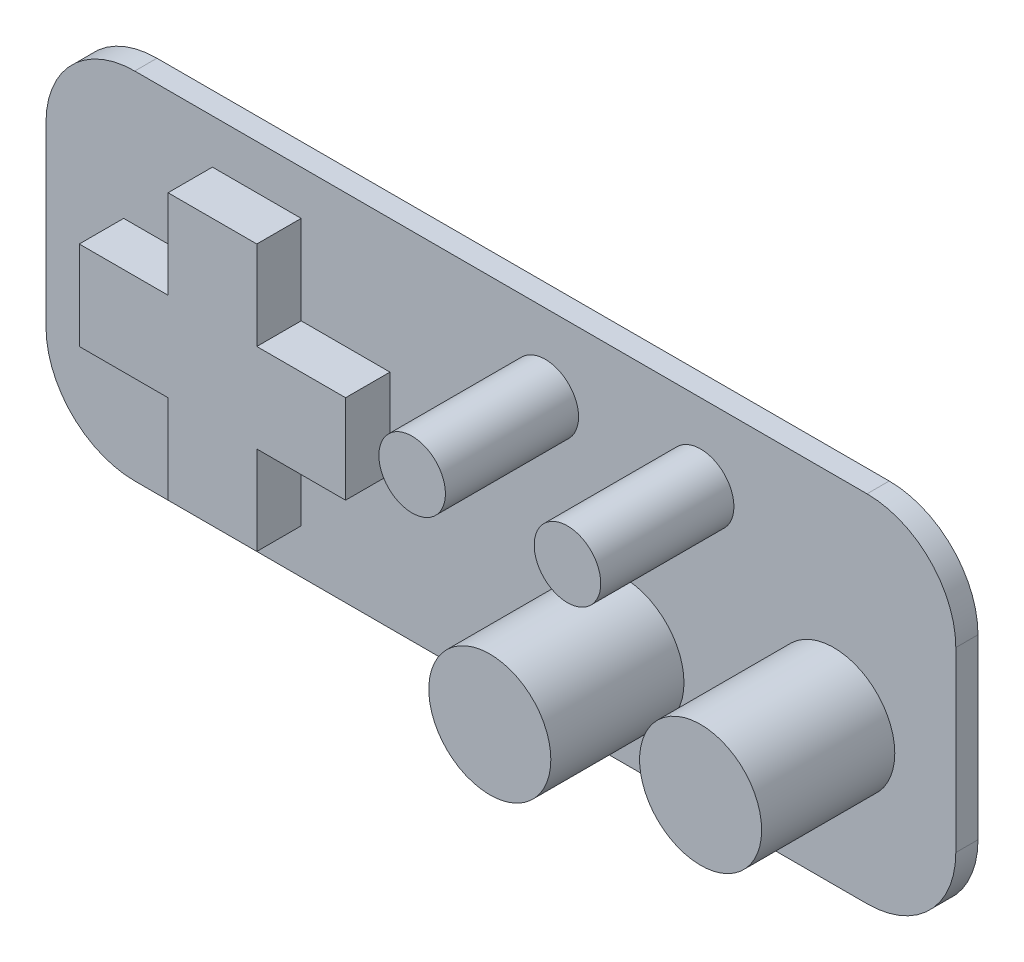
ISO-10303-21;
HEADER;
FILE_DESCRIPTION(('STEP AP214'),'2;1');
FILE_NAME('part.step','',(''),(''),'','','');
FILE_SCHEMA(('AUTOMOTIVE_DESIGN { 1 0 10303 214 1 1 1 1 }'));
ENDSEC;
DATA;
#1=APPLICATION_CONTEXT('core data for automotive mechanical design processes');
#2=APPLICATION_PROTOCOL_DEFINITION('international standard','automotive_design',2000,#1);
#3=PRODUCT_CONTEXT('',#1,'mechanical');
#4=PRODUCT('Part','Part','',(#3));
#5=PRODUCT_RELATED_PRODUCT_CATEGORY('part','',(#4));
#6=PRODUCT_DEFINITION_FORMATION('','',#4);
#7=PRODUCT_DEFINITION_CONTEXT('part definition',#1,'design');
#8=PRODUCT_DEFINITION('design','',#6,#7);
#9=PRODUCT_DEFINITION_SHAPE('','',#8);
#10=(LENGTH_UNIT() NAMED_UNIT(*) SI_UNIT(.MILLI.,.METRE.));
#11=(NAMED_UNIT(*) PLANE_ANGLE_UNIT() SI_UNIT($,.RADIAN.));
#12=(NAMED_UNIT(*) SI_UNIT($,.STERADIAN.) SOLID_ANGLE_UNIT());
#13=UNCERTAINTY_MEASURE_WITH_UNIT(LENGTH_MEASURE(1.E-05),#10,'distance_accuracy_value','');
#14=(GEOMETRIC_REPRESENTATION_CONTEXT(3) GLOBAL_UNCERTAINTY_ASSIGNED_CONTEXT((#13)) GLOBAL_UNIT_ASSIGNED_CONTEXT((#10,
#11,#12)) REPRESENTATION_CONTEXT('',''));
#15=CARTESIAN_POINT('',(0.,0.,0.));
#16=DIRECTION('',(0.,0.,1.));
#17=DIRECTION('',(1.,0.,0.));
#18=AXIS2_PLACEMENT_3D('',#15,#16,#17);
#19=CARTESIAN_POINT('',(-15.7826086956522,4.75,1.));
#20=DIRECTION('',(0.,0.,1.));
#21=DIRECTION('',(1.,0.,0.));
#22=AXIS2_PLACEMENT_3D('',#19,#20,#21);
#23=PLANE('',#22);
#24=CARTESIAN_POINT('',(15.7173913043478,-0.750000000000002,1.));
#25=DIRECTION('',(0.,0.,1.));
#26=DIRECTION('',(1.,0.,0.));
#27=AXIS2_PLACEMENT_3D('',#24,#25,#26);
#28=CIRCLE('',#27,2.74999999999999);
#29=CARTESIAN_POINT('',(18.4673913043478,-0.750000000000002,1.));
#30=VERTEX_POINT('',#29);
#31=EDGE_CURVE('E212',#30,#30,#28,.T.);
#32=ORIENTED_EDGE('',*,*,#31,.F.);
#33=EDGE_LOOP('',(#32));
#34=FACE_BOUND('',#33,.T.);
#35=CARTESIAN_POINT('',(6.21739130434783,-2.75,1.));
#36=DIRECTION('',(0.,0.,1.));
#37=DIRECTION('',(1.,0.,0.));
#38=AXIS2_PLACEMENT_3D('',#35,#36,#37);
#39=CIRCLE('',#38,2.75);
#40=CARTESIAN_POINT('',(8.96739130434783,-2.75,1.));
#41=VERTEX_POINT('',#40);
#42=EDGE_CURVE('E206',#41,#41,#39,.T.);
#43=ORIENTED_EDGE('',*,*,#42,.F.);
#44=EDGE_LOOP('',(#43));
#45=FACE_BOUND('',#44,.T.);
#46=CARTESIAN_POINT('',(9.71739130434783,5.25,1.));
#47=DIRECTION('',(0.,0.,1.));
#48=DIRECTION('',(1.,0.,0.));
#49=AXIS2_PLACEMENT_3D('',#46,#47,#48);
#50=CIRCLE('',#49,1.5);
#51=CARTESIAN_POINT('',(11.2173913043478,5.25,1.));
#52=VERTEX_POINT('',#51);
#53=EDGE_CURVE('E200',#52,#52,#50,.T.);
#54=ORIENTED_EDGE('',*,*,#53,.F.);
#55=EDGE_LOOP('',(#54));
#56=FACE_BOUND('',#55,.T.);
#57=CARTESIAN_POINT('',(2.71739130434783,5.25,1.));
#58=DIRECTION('',(0.,0.,1.));
#59=DIRECTION('',(1.,0.,0.));
#60=AXIS2_PLACEMENT_3D('',#57,#58,#59);
#61=CIRCLE('',#60,1.5);
#62=CARTESIAN_POINT('',(4.21739130434783,5.25,1.));
#63=VERTEX_POINT('',#62);
#64=EDGE_CURVE('E194',#63,#63,#61,.T.);
#65=ORIENTED_EDGE('',*,*,#64,.F.);
#66=EDGE_LOOP('',(#65));
#67=FACE_BOUND('',#66,.T.);
#68=CARTESIAN_POINT('',(-15.7826086956522,4.75,1.));
#69=DIRECTION('',(0.,0.,1.));
#70=DIRECTION('',(1.,0.,0.));
#71=AXIS2_PLACEMENT_3D('',#68,#69,#70);
#72=CIRCLE('',#71,4.);
#73=CARTESIAN_POINT('',(-15.7826086956521,8.75,1.));
#74=VERTEX_POINT('',#73);
#75=CARTESIAN_POINT('',(-19.7826086956522,4.74999999999997,1.));
#76=VERTEX_POINT('',#75);
#77=EDGE_CURVE('E161',#74,#76,#72,.T.);
#78=ORIENTED_EDGE('',*,*,#77,.T.);
#79=DIRECTION('',(0.,-1.,0.));
#80=VECTOR('',#79,1.);
#81=CARTESIAN_POINT('',(-19.7826086956522,4.74999999999997,1.));
#82=LINE('',#81,#80);
#83=CARTESIAN_POINT('',(-19.7826086956522,-3.24999999999997,1.));
#84=VERTEX_POINT('',#83);
#85=EDGE_CURVE('E102',#76,#84,#82,.T.);
#86=ORIENTED_EDGE('',*,*,#85,.T.);
#87=CARTESIAN_POINT('',(-15.7826086956522,-3.25,1.));
#88=DIRECTION('',(0.,0.,1.));
#89=DIRECTION('',(1.,0.,0.));
#90=AXIS2_PLACEMENT_3D('',#87,#88,#89);
#91=CIRCLE('',#90,4.);
#92=CARTESIAN_POINT('',(-15.7826086956521,-7.25,1.));
#93=VERTEX_POINT('',#92);
#94=EDGE_CURVE('E176',#84,#93,#91,.T.);
#95=ORIENTED_EDGE('',*,*,#94,.T.);
#96=DIRECTION('',(1.,0.,0.));
#97=VECTOR('',#96,1.);
#98=CARTESIAN_POINT('',(-15.7826086956521,-7.25,1.));
#99=LINE('',#98,#97);
#100=CARTESIAN_POINT('',(17.2173913043478,-7.25,1.));
#101=VERTEX_POINT('',#100);
#102=EDGE_CURVE('E188',#93,#101,#99,.T.);
#103=ORIENTED_EDGE('',*,*,#102,.T.);
#104=CARTESIAN_POINT('',(17.2173913043478,-3.25,1.));
#105=DIRECTION('',(0.,0.,1.));
#106=DIRECTION('',(1.,0.,0.));
#107=AXIS2_PLACEMENT_3D('',#104,#105,#106);
#108=CIRCLE('',#107,4.);
#109=CARTESIAN_POINT('',(21.2173913043478,-3.25,1.));
#110=VERTEX_POINT('',#109);
#111=EDGE_CURVE('E124',#101,#110,#108,.T.);
#112=ORIENTED_EDGE('',*,*,#111,.T.);
#113=DIRECTION('',(0.,1.,0.));
#114=VECTOR('',#113,1.);
#115=CARTESIAN_POINT('',(21.2173913043478,4.75,1.));
#116=LINE('',#115,#114);
#117=CARTESIAN_POINT('',(21.2173913043478,4.75,1.));
#118=VERTEX_POINT('',#117);
#119=EDGE_CURVE('E117',#110,#118,#116,.T.);
#120=ORIENTED_EDGE('',*,*,#119,.T.);
#121=CARTESIAN_POINT('',(17.2173913043478,4.75,1.));
#122=DIRECTION('',(0.,0.,1.));
#123=DIRECTION('',(-1.,0.,0.));
#124=AXIS2_PLACEMENT_3D('',#121,#122,#123);
#125=CIRCLE('',#124,4.);
#126=CARTESIAN_POINT('',(17.2173913043478,8.75,1.));
#127=VERTEX_POINT('',#126);
#128=EDGE_CURVE('E121',#118,#127,#125,.T.);
#129=ORIENTED_EDGE('',*,*,#128,.T.);
#130=DIRECTION('',(-1.,0.,0.));
#131=VECTOR('',#130,1.);
#132=CARTESIAN_POINT('',(-15.7826086956521,8.75,1.));
#133=LINE('',#132,#131);
#134=EDGE_CURVE('E61',#127,#74,#133,.T.);
#135=ORIENTED_EDGE('',*,*,#134,.T.);
#136=EDGE_LOOP('',(#78,#86,#95,#103,#112,#120,#129,#135));
#137=FACE_BOUND('',#136,.T.);
#138=DIRECTION('',(1.,0.,0.));
#139=VECTOR('',#138,1.);
#140=CARTESIAN_POINT('',(-15.7826086956522,6.75,1.));
#141=LINE('',#140,#139);
#142=CARTESIAN_POINT('',(-12.2826086956522,6.75,1.));
#143=VERTEX_POINT('',#142);
#144=CARTESIAN_POINT('',(-8.28260869565216,6.75,1.));
#145=VERTEX_POINT('',#144);
#146=EDGE_CURVE('E220',#143,#145,#141,.T.);
#147=ORIENTED_EDGE('',*,*,#146,.T.);
#148=DIRECTION('',(0.,-1.,0.));
#149=VECTOR('',#148,1.);
#150=CARTESIAN_POINT('',(-8.28260869565216,4.75,1.));
#151=LINE('',#150,#149);
#152=CARTESIAN_POINT('',(-8.28260869565216,2.75,1.));
#153=VERTEX_POINT('',#152);
#154=EDGE_CURVE('E215',#145,#153,#151,.T.);
#155=ORIENTED_EDGE('',*,*,#154,.T.);
#156=DIRECTION('',(1.,0.,0.));
#157=VECTOR('',#156,1.);
#158=CARTESIAN_POINT('',(-15.7826086956522,2.75,1.));
#159=LINE('',#158,#157);
#160=CARTESIAN_POINT('',(-4.28260869565216,2.75,1.));
#161=VERTEX_POINT('',#160);
#162=EDGE_CURVE('E250',#153,#161,#159,.T.);
#163=ORIENTED_EDGE('',*,*,#162,.T.);
#164=DIRECTION('',(0.,-1.,0.));
#165=VECTOR('',#164,1.);
#166=CARTESIAN_POINT('',(-4.28260869565216,4.75000000000001,1.));
#167=LINE('',#166,#165);
#168=CARTESIAN_POINT('',(-4.28260869565216,-1.25,1.));
#169=VERTEX_POINT('',#168);
#170=EDGE_CURVE('E247',#161,#169,#167,.T.);
#171=ORIENTED_EDGE('',*,*,#170,.T.);
#172=DIRECTION('',(-1.,0.,0.));
#173=VECTOR('',#172,1.);
#174=CARTESIAN_POINT('',(-15.7826086956522,-1.25,1.));
#175=LINE('',#174,#173);
#176=CARTESIAN_POINT('',(-8.28260869565216,-1.25,1.));
#177=VERTEX_POINT('',#176);
#178=EDGE_CURVE('E244',#169,#177,#175,.T.);
#179=ORIENTED_EDGE('',*,*,#178,.T.);
#180=DIRECTION('',(0.,-1.,0.));
#181=VECTOR('',#180,1.);
#182=CARTESIAN_POINT('',(-8.28260869565217,4.75000000000001,1.));
#183=LINE('',#182,#181);
#184=CARTESIAN_POINT('',(-8.28260869565216,-5.25,1.));
#185=VERTEX_POINT('',#184);
#186=EDGE_CURVE('E241',#177,#185,#183,.T.);
#187=ORIENTED_EDGE('',*,*,#186,.T.);
#188=DIRECTION('',(-1.,0.,0.));
#189=VECTOR('',#188,1.);
#190=CARTESIAN_POINT('',(-15.7826086956522,-5.25,1.));
#191=LINE('',#190,#189);
#192=CARTESIAN_POINT('',(-12.2826086956522,-5.25,1.));
#193=VERTEX_POINT('',#192);
#194=EDGE_CURVE('E238',#185,#193,#191,.T.);
#195=ORIENTED_EDGE('',*,*,#194,.T.);
#196=DIRECTION('',(0.,1.,0.));
#197=VECTOR('',#196,1.);
#198=CARTESIAN_POINT('',(-12.2826086956522,4.75,1.));
#199=LINE('',#198,#197);
#200=CARTESIAN_POINT('',(-12.2826086956522,-1.25,1.));
#201=VERTEX_POINT('',#200);
#202=EDGE_CURVE('E235',#193,#201,#199,.T.);
#203=ORIENTED_EDGE('',*,*,#202,.T.);
#204=DIRECTION('',(-1.,0.,0.));
#205=VECTOR('',#204,1.);
#206=CARTESIAN_POINT('',(-15.7826086956522,-1.25,1.));
#207=LINE('',#206,#205);
#208=CARTESIAN_POINT('',(-16.2826086956522,-1.25,1.));
#209=VERTEX_POINT('',#208);
#210=EDGE_CURVE('E232',#201,#209,#207,.T.);
#211=ORIENTED_EDGE('',*,*,#210,.T.);
#212=DIRECTION('',(0.,1.,0.));
#213=VECTOR('',#212,1.);
#214=CARTESIAN_POINT('',(-16.2826086956522,4.75,1.));
#215=LINE('',#214,#213);
#216=CARTESIAN_POINT('',(-16.2826086956522,2.75,1.));
#217=VERTEX_POINT('',#216);
#218=EDGE_CURVE('E229',#209,#217,#215,.T.);
#219=ORIENTED_EDGE('',*,*,#218,.T.);
#220=DIRECTION('',(1.,0.,0.));
#221=VECTOR('',#220,1.);
#222=CARTESIAN_POINT('',(-15.7826086956522,2.75,1.));
#223=LINE('',#222,#221);
#224=CARTESIAN_POINT('',(-12.2826086956522,2.75,1.));
#225=VERTEX_POINT('',#224);
#226=EDGE_CURVE('E226',#217,#225,#223,.T.);
#227=ORIENTED_EDGE('',*,*,#226,.T.);
#228=DIRECTION('',(0.,1.,0.));
#229=VECTOR('',#228,1.);
#230=CARTESIAN_POINT('',(-12.2826086956522,4.75,1.));
#231=LINE('',#230,#229);
#232=EDGE_CURVE('E223',#225,#143,#231,.T.);
#233=ORIENTED_EDGE('',*,*,#232,.T.);
#234=EDGE_LOOP('',(#147,#155,#163,#171,#179,#187,#195,#203,#211,#219,#227,#233));
#235=FACE_BOUND('',#234,.T.);
#236=ADVANCED_FACE('F37',(#34,#45,#56,#67,#137,#235),#23,.T.);
#237=CARTESIAN_POINT('',(-15.7826086956522,4.75,1.));
#238=DIRECTION('',(0.,0.,-1.));
#239=DIRECTION('',(-1.,0.,0.));
#240=AXIS2_PLACEMENT_3D('',#237,#238,#239);
#241=CYLINDRICAL_SURFACE('',#240,4.);
#242=CARTESIAN_POINT('',(-15.7826086956522,4.75,0.));
#243=DIRECTION('',(0.,0.,1.));
#244=DIRECTION('',(1.,0.,0.));
#245=AXIS2_PLACEMENT_3D('',#242,#243,#244);
#246=CIRCLE('',#245,4.);
#247=CARTESIAN_POINT('',(-15.7826086956521,8.75,0.));
#248=VERTEX_POINT('',#247);
#249=CARTESIAN_POINT('',(-19.7826086956522,4.74999999999997,0.));
#250=VERTEX_POINT('',#249);
#251=EDGE_CURVE('E145',#248,#250,#246,.T.);
#252=ORIENTED_EDGE('',*,*,#251,.T.);
#253=DIRECTION('',(0.,0.,-1.));
#254=VECTOR('',#253,1.);
#255=CARTESIAN_POINT('',(-19.7826086956522,4.74999999999997,1.));
#256=LINE('',#255,#254);
#257=EDGE_CURVE('E11',#76,#250,#256,.T.);
#258=ORIENTED_EDGE('',*,*,#257,.F.);
#259=ORIENTED_EDGE('',*,*,#77,.F.);
#260=DIRECTION('',(0.,0.,-1.));
#261=VECTOR('',#260,1.);
#262=CARTESIAN_POINT('',(-15.7826086956521,8.75,1.));
#263=LINE('',#262,#261);
#264=EDGE_CURVE('E141',#74,#248,#263,.T.);
#265=ORIENTED_EDGE('',*,*,#264,.T.);
#266=EDGE_LOOP('',(#252,#258,#259,#265));
#267=FACE_BOUND('',#266,.T.);
#268=ADVANCED_FACE('F39',(#267),#241,.T.);
#269=CARTESIAN_POINT('',(-19.7826086956522,4.74999999999997,1.));
#270=DIRECTION('',(1.,0.,0.));
#271=DIRECTION('',(0.,1.,0.));
#272=AXIS2_PLACEMENT_3D('',#269,#270,#271);
#273=PLANE('',#272);
#274=DIRECTION('',(0.,-1.,0.));
#275=VECTOR('',#274,1.);
#276=CARTESIAN_POINT('',(-19.7826086956522,4.74999999999997,0.));
#277=LINE('',#276,#275);
#278=CARTESIAN_POINT('',(-19.7826086956522,-3.24999999999997,0.));
#279=VERTEX_POINT('',#278);
#280=EDGE_CURVE('E148',#250,#279,#277,.T.);
#281=ORIENTED_EDGE('',*,*,#280,.T.);
#282=DIRECTION('',(0.,0.,-1.));
#283=VECTOR('',#282,1.);
#284=CARTESIAN_POINT('',(-19.7826086956522,-3.24999999999997,1.));
#285=LINE('',#284,#283);
#286=EDGE_CURVE('E45',#84,#279,#285,.T.);
#287=ORIENTED_EDGE('',*,*,#286,.F.);
#288=ORIENTED_EDGE('',*,*,#85,.F.);
#289=ORIENTED_EDGE('',*,*,#257,.T.);
#290=EDGE_LOOP('',(#281,#287,#288,#289));
#291=FACE_BOUND('',#290,.T.);
#292=ADVANCED_FACE('F436',(#291),#273,.F.);
#293=CARTESIAN_POINT('',(-15.7826086956522,-3.25,1.));
#294=DIRECTION('',(0.,0.,-1.));
#295=DIRECTION('',(-1.,0.,0.));
#296=AXIS2_PLACEMENT_3D('',#293,#294,#295);
#297=CYLINDRICAL_SURFACE('',#296,4.);
#298=CARTESIAN_POINT('',(-15.7826086956522,-3.25,0.));
#299=DIRECTION('',(0.,0.,1.));
#300=DIRECTION('',(1.,0.,0.));
#301=AXIS2_PLACEMENT_3D('',#298,#299,#300);
#302=CIRCLE('',#301,4.);
#303=CARTESIAN_POINT('',(-15.7826086956521,-7.25,0.));
#304=VERTEX_POINT('',#303);
#305=EDGE_CURVE('E151',#279,#304,#302,.T.);
#306=ORIENTED_EDGE('',*,*,#305,.T.);
#307=DIRECTION('',(0.,0.,-1.));
#308=VECTOR('',#307,1.);
#309=CARTESIAN_POINT('',(-15.7826086956521,-7.25,1.));
#310=LINE('',#309,#308);
#311=EDGE_CURVE('E168',#93,#304,#310,.T.);
#312=ORIENTED_EDGE('',*,*,#311,.F.);
#313=ORIENTED_EDGE('',*,*,#94,.F.);
#314=ORIENTED_EDGE('',*,*,#286,.T.);
#315=EDGE_LOOP('',(#306,#312,#313,#314));
#316=FACE_BOUND('',#315,.T.);
#317=ADVANCED_FACE('F174',(#316),#297,.T.);
#318=CARTESIAN_POINT('',(-15.7826086956521,-7.25,1.));
#319=DIRECTION('',(0.,1.,0.));
#320=DIRECTION('',(0.,0.,1.));
#321=AXIS2_PLACEMENT_3D('',#318,#319,#320);
#322=PLANE('',#321);
#323=DIRECTION('',(1.,0.,0.));
#324=VECTOR('',#323,1.);
#325=CARTESIAN_POINT('',(-15.7826086956521,-7.25,0.));
#326=LINE('',#325,#324);
#327=CARTESIAN_POINT('',(17.2173913043478,-7.25,0.));
#328=VERTEX_POINT('',#327);
#329=EDGE_CURVE('E153',#304,#328,#326,.T.);
#330=ORIENTED_EDGE('',*,*,#329,.T.);
#331=DIRECTION('',(0.,0.,-1.));
#332=VECTOR('',#331,1.);
#333=CARTESIAN_POINT('',(17.2173913043478,-7.25,1.));
#334=LINE('',#333,#332);
#335=EDGE_CURVE('E165',#101,#328,#334,.T.);
#336=ORIENTED_EDGE('',*,*,#335,.F.);
#337=ORIENTED_EDGE('',*,*,#102,.F.);
#338=ORIENTED_EDGE('',*,*,#311,.T.);
#339=EDGE_LOOP('',(#330,#336,#337,#338));
#340=FACE_BOUND('',#339,.T.);
#341=ADVANCED_FACE('F184',(#340),#322,.F.);
#342=CARTESIAN_POINT('',(17.2173913043478,-3.25,1.));
#343=DIRECTION('',(0.,0.,-1.));
#344=DIRECTION('',(-1.,0.,0.));
#345=AXIS2_PLACEMENT_3D('',#342,#343,#344);
#346=CYLINDRICAL_SURFACE('',#345,4.);
#347=CARTESIAN_POINT('',(17.2173913043478,-3.25,0.));
#348=DIRECTION('',(0.,0.,1.));
#349=DIRECTION('',(1.,0.,0.));
#350=AXIS2_PLACEMENT_3D('',#347,#348,#349);
#351=CIRCLE('',#350,4.);
#352=CARTESIAN_POINT('',(21.2173913043478,-3.25,0.));
#353=VERTEX_POINT('',#352);
#354=EDGE_CURVE('E155',#328,#353,#351,.T.);
#355=ORIENTED_EDGE('',*,*,#354,.T.);
#356=DIRECTION('',(0.,0.,-1.));
#357=VECTOR('',#356,1.);
#358=CARTESIAN_POINT('',(21.2173913043478,-3.25,1.));
#359=LINE('',#358,#357);
#360=EDGE_CURVE('E136',#110,#353,#359,.T.);
#361=ORIENTED_EDGE('',*,*,#360,.F.);
#362=ORIENTED_EDGE('',*,*,#111,.F.);
#363=ORIENTED_EDGE('',*,*,#335,.T.);
#364=EDGE_LOOP('',(#355,#361,#362,#363));
#365=FACE_BOUND('',#364,.T.);
#366=ADVANCED_FACE('F187',(#365),#346,.T.);
#367=CARTESIAN_POINT('',(21.2173913043478,4.75,1.));
#368=DIRECTION('',(-1.,0.,0.));
#369=DIRECTION('',(0.,0.,1.));
#370=AXIS2_PLACEMENT_3D('',#367,#368,#369);
#371=PLANE('',#370);
#372=DIRECTION('',(0.,1.,0.));
#373=VECTOR('',#372,1.);
#374=CARTESIAN_POINT('',(21.2173913043478,4.75,0.));
#375=LINE('',#374,#373);
#376=CARTESIAN_POINT('',(21.2173913043478,4.75,0.));
#377=VERTEX_POINT('',#376);
#378=EDGE_CURVE('E133',#353,#377,#375,.T.);
#379=ORIENTED_EDGE('',*,*,#378,.T.);
#380=DIRECTION('',(0.,0.,-1.));
#381=VECTOR('',#380,1.);
#382=CARTESIAN_POINT('',(21.2173913043478,4.75,1.));
#383=LINE('',#382,#381);
#384=EDGE_CURVE('E130',#118,#377,#383,.T.);
#385=ORIENTED_EDGE('',*,*,#384,.F.);
#386=ORIENTED_EDGE('',*,*,#119,.F.);
#387=ORIENTED_EDGE('',*,*,#360,.T.);
#388=EDGE_LOOP('',(#379,#385,#386,#387));
#389=FACE_BOUND('',#388,.T.);
#390=ADVANCED_FACE('F131',(#389),#371,.F.);
#391=CARTESIAN_POINT('',(17.2173913043478,4.75,1.));
#392=DIRECTION('',(0.,0.,-1.));
#393=DIRECTION('',(-1.,0.,0.));
#394=AXIS2_PLACEMENT_3D('',#391,#392,#393);
#395=CYLINDRICAL_SURFACE('',#394,4.);
#396=CARTESIAN_POINT('',(17.2173913043478,4.75,0.));
#397=DIRECTION('',(0.,0.,1.));
#398=DIRECTION('',(-1.,0.,0.));
#399=AXIS2_PLACEMENT_3D('',#396,#397,#398);
#400=CIRCLE('',#399,4.);
#401=CARTESIAN_POINT('',(17.2173913043478,8.75,0.));
#402=VERTEX_POINT('',#401);
#403=EDGE_CURVE('E158',#377,#402,#400,.T.);
#404=ORIENTED_EDGE('',*,*,#403,.T.);
#405=DIRECTION('',(0.,0.,-1.));
#406=VECTOR('',#405,1.);
#407=CARTESIAN_POINT('',(17.2173913043478,8.75,1.));
#408=LINE('',#407,#406);
#409=EDGE_CURVE('E137',#127,#402,#408,.T.);
#410=ORIENTED_EDGE('',*,*,#409,.F.);
#411=ORIENTED_EDGE('',*,*,#128,.F.);
#412=ORIENTED_EDGE('',*,*,#384,.T.);
#413=EDGE_LOOP('',(#404,#410,#411,#412));
#414=FACE_BOUND('',#413,.T.);
#415=ADVANCED_FACE('F139',(#414),#395,.T.);
#416=CARTESIAN_POINT('',(-15.7826086956521,8.75,1.));
#417=DIRECTION('',(0.,-1.,0.));
#418=DIRECTION('',(0.,0.,-1.));
#419=AXIS2_PLACEMENT_3D('',#416,#417,#418);
#420=PLANE('',#419);
#421=DIRECTION('',(-1.,0.,0.));
#422=VECTOR('',#421,1.);
#423=CARTESIAN_POINT('',(-15.7826086956521,8.75,0.));
#424=LINE('',#423,#422);
#425=EDGE_CURVE('E94',#402,#248,#424,.T.);
#426=ORIENTED_EDGE('',*,*,#425,.T.);
#427=ORIENTED_EDGE('',*,*,#264,.F.);
#428=ORIENTED_EDGE('',*,*,#134,.F.);
#429=ORIENTED_EDGE('',*,*,#409,.T.);
#430=EDGE_LOOP('',(#426,#427,#428,#429));
#431=FACE_BOUND('',#430,.T.);
#432=ADVANCED_FACE('F446',(#431),#420,.F.);
#433=CARTESIAN_POINT('',(-15.7826086956522,4.75,0.));
#434=DIRECTION('',(0.,0.,1.));
#435=DIRECTION('',(1.,0.,0.));
#436=AXIS2_PLACEMENT_3D('',#433,#434,#435);
#437=PLANE('',#436);
#438=ORIENTED_EDGE('',*,*,#251,.F.);
#439=ORIENTED_EDGE('',*,*,#425,.F.);
#440=ORIENTED_EDGE('',*,*,#403,.F.);
#441=ORIENTED_EDGE('',*,*,#378,.F.);
#442=ORIENTED_EDGE('',*,*,#354,.F.);
#443=ORIENTED_EDGE('',*,*,#329,.F.);
#444=ORIENTED_EDGE('',*,*,#305,.F.);
#445=ORIENTED_EDGE('',*,*,#280,.F.);
#446=EDGE_LOOP('',(#438,#439,#440,#441,#442,#443,#444,#445));
#447=FACE_BOUND('',#446,.T.);
#448=ADVANCED_FACE('F180',(#447),#437,.F.);
#449=CARTESIAN_POINT('',(2.71739130434783,5.25,7.));
#450=DIRECTION('',(0.,0.,-1.));
#451=DIRECTION('',(-1.,0.,0.));
#452=AXIS2_PLACEMENT_3D('',#449,#450,#451);
#453=CYLINDRICAL_SURFACE('',#452,1.5);
#454=CARTESIAN_POINT('',(2.71739130434783,5.25,7.));
#455=DIRECTION('',(0.,0.,1.));
#456=DIRECTION('',(1.,0.,0.));
#457=AXIS2_PLACEMENT_3D('',#454,#455,#456);
#458=CIRCLE('',#457,1.5);
#459=CARTESIAN_POINT('',(4.21739130434783,5.25,7.));
#460=VERTEX_POINT('',#459);
#461=EDGE_CURVE('E149',#460,#460,#458,.T.);
#462=ORIENTED_EDGE('',*,*,#461,.F.);
#463=EDGE_LOOP('',(#462));
#464=FACE_BOUND('',#463,.T.);
#465=ORIENTED_EDGE('',*,*,#64,.T.);
#466=EDGE_LOOP('',(#465));
#467=FACE_BOUND('',#466,.T.);
#468=ADVANCED_FACE('F442',(#464,#467),#453,.T.);
#469=CARTESIAN_POINT('',(0.,0.,7.));
#470=DIRECTION('',(0.,0.,1.));
#471=DIRECTION('',(1.,0.,0.));
#472=AXIS2_PLACEMENT_3D('',#469,#470,#471);
#473=PLANE('',#472);
#474=ORIENTED_EDGE('',*,*,#461,.T.);
#475=EDGE_LOOP('',(#474));
#476=FACE_BOUND('',#475,.T.);
#477=ADVANCED_FACE('F500',(#476),#473,.T.);
#478=CARTESIAN_POINT('',(9.71739130434783,5.25,7.));
#479=DIRECTION('',(0.,0.,-1.));
#480=DIRECTION('',(-1.,0.,0.));
#481=AXIS2_PLACEMENT_3D('',#478,#479,#480);
#482=CYLINDRICAL_SURFACE('',#481,1.5);
#483=CARTESIAN_POINT('',(9.71739130434783,5.25,7.));
#484=DIRECTION('',(0.,0.,1.));
#485=DIRECTION('',(1.,0.,0.));
#486=AXIS2_PLACEMENT_3D('',#483,#484,#485);
#487=CIRCLE('',#486,1.5);
#488=CARTESIAN_POINT('',(11.2173913043478,5.25,7.));
#489=VERTEX_POINT('',#488);
#490=EDGE_CURVE('E197',#489,#489,#487,.T.);
#491=ORIENTED_EDGE('',*,*,#490,.F.);
#492=EDGE_LOOP('',(#491));
#493=FACE_BOUND('',#492,.T.);
#494=ORIENTED_EDGE('',*,*,#53,.T.);
#495=EDGE_LOOP('',(#494));
#496=FACE_BOUND('',#495,.T.);
#497=ADVANCED_FACE('F507',(#493,#496),#482,.T.);
#498=CARTESIAN_POINT('',(0.,0.,7.));
#499=DIRECTION('',(0.,0.,1.));
#500=DIRECTION('',(1.,0.,0.));
#501=AXIS2_PLACEMENT_3D('',#498,#499,#500);
#502=PLANE('',#501);
#503=ORIENTED_EDGE('',*,*,#490,.T.);
#504=EDGE_LOOP('',(#503));
#505=FACE_BOUND('',#504,.T.);
#506=ADVANCED_FACE('F514',(#505),#502,.T.);
#507=CARTESIAN_POINT('',(6.21739130434783,-2.75,7.));
#508=DIRECTION('',(0.,0.,-1.));
#509=DIRECTION('',(-1.,0.,0.));
#510=AXIS2_PLACEMENT_3D('',#507,#508,#509);
#511=CYLINDRICAL_SURFACE('',#510,2.75);
#512=CARTESIAN_POINT('',(6.21739130434783,-2.75,7.));
#513=DIRECTION('',(0.,0.,1.));
#514=DIRECTION('',(1.,0.,0.));
#515=AXIS2_PLACEMENT_3D('',#512,#513,#514);
#516=CIRCLE('',#515,2.75);
#517=CARTESIAN_POINT('',(8.96739130434783,-2.75,7.));
#518=VERTEX_POINT('',#517);
#519=EDGE_CURVE('E203',#518,#518,#516,.T.);
#520=ORIENTED_EDGE('',*,*,#519,.F.);
#521=EDGE_LOOP('',(#520));
#522=FACE_BOUND('',#521,.T.);
#523=ORIENTED_EDGE('',*,*,#42,.T.);
#524=EDGE_LOOP('',(#523));
#525=FACE_BOUND('',#524,.T.);
#526=ADVANCED_FACE('F522',(#522,#525),#511,.T.);
#527=CARTESIAN_POINT('',(0.,0.,7.));
#528=DIRECTION('',(0.,0.,1.));
#529=DIRECTION('',(1.,0.,0.));
#530=AXIS2_PLACEMENT_3D('',#527,#528,#529);
#531=PLANE('',#530);
#532=ORIENTED_EDGE('',*,*,#519,.T.);
#533=EDGE_LOOP('',(#532));
#534=FACE_BOUND('',#533,.T.);
#535=ADVANCED_FACE('F530',(#534),#531,.T.);
#536=CARTESIAN_POINT('',(15.7173913043478,-0.750000000000002,7.));
#537=DIRECTION('',(0.,0.,-1.));
#538=DIRECTION('',(-1.,0.,0.));
#539=AXIS2_PLACEMENT_3D('',#536,#537,#538);
#540=CYLINDRICAL_SURFACE('',#539,2.74999999999999);
#541=CARTESIAN_POINT('',(15.7173913043478,-0.750000000000002,7.));
#542=DIRECTION('',(0.,0.,1.));
#543=DIRECTION('',(1.,0.,0.));
#544=AXIS2_PLACEMENT_3D('',#541,#542,#543);
#545=CIRCLE('',#544,2.74999999999999);
#546=CARTESIAN_POINT('',(18.4673913043478,-0.750000000000002,7.));
#547=VERTEX_POINT('',#546);
#548=EDGE_CURVE('E209',#547,#547,#545,.T.);
#549=ORIENTED_EDGE('',*,*,#548,.F.);
#550=EDGE_LOOP('',(#549));
#551=FACE_BOUND('',#550,.T.);
#552=ORIENTED_EDGE('',*,*,#31,.T.);
#553=EDGE_LOOP('',(#552));
#554=FACE_BOUND('',#553,.T.);
#555=ADVANCED_FACE('F538',(#551,#554),#540,.T.);
#556=CARTESIAN_POINT('',(0.,0.,7.));
#557=DIRECTION('',(0.,0.,1.));
#558=DIRECTION('',(1.,0.,0.));
#559=AXIS2_PLACEMENT_3D('',#556,#557,#558);
#560=PLANE('',#559);
#561=ORIENTED_EDGE('',*,*,#548,.T.);
#562=EDGE_LOOP('',(#561));
#563=FACE_BOUND('',#562,.T.);
#564=ADVANCED_FACE('F546',(#563),#560,.T.);
#565=CARTESIAN_POINT('',(-8.28260869565216,0.,3.));
#566=DIRECTION('',(-1.,0.,0.));
#567=DIRECTION('',(0.,0.,1.));
#568=AXIS2_PLACEMENT_3D('',#565,#566,#567);
#569=PLANE('',#568);
#570=ORIENTED_EDGE('',*,*,#154,.F.);
#571=DIRECTION('',(0.,0.,-1.));
#572=VECTOR('',#571,1.);
#573=CARTESIAN_POINT('',(-8.28260869565216,6.75,3.));
#574=LINE('',#573,#572);
#575=CARTESIAN_POINT('',(-8.28260869565216,6.75,3.));
#576=VERTEX_POINT('',#575);
#577=EDGE_CURVE('E253',#576,#145,#574,.T.);
#578=ORIENTED_EDGE('',*,*,#577,.F.);
#579=DIRECTION('',(0.,1.,0.));
#580=VECTOR('',#579,1.);
#581=CARTESIAN_POINT('',(-8.28260869565216,0.,3.));
#582=LINE('',#581,#580);
#583=CARTESIAN_POINT('',(-8.28260869565216,2.75,3.));
#584=VERTEX_POINT('',#583);
#585=EDGE_CURVE('E320',#584,#576,#582,.T.);
#586=ORIENTED_EDGE('',*,*,#585,.F.);
#587=DIRECTION('',(0.,0.,-1.));
#588=VECTOR('',#587,1.);
#589=CARTESIAN_POINT('',(-8.28260869565216,2.75,3.));
#590=LINE('',#589,#588);
#591=EDGE_CURVE('E284',#584,#153,#590,.T.);
#592=ORIENTED_EDGE('',*,*,#591,.T.);
#593=EDGE_LOOP('',(#570,#578,#586,#592));
#594=FACE_BOUND('',#593,.T.);
#595=ADVANCED_FACE('F335',(#594),#569,.F.);
#596=CARTESIAN_POINT('',(0.,6.75,3.));
#597=DIRECTION('',(0.,-1.,0.));
#598=DIRECTION('',(0.,0.,-1.));
#599=AXIS2_PLACEMENT_3D('',#596,#597,#598);
#600=PLANE('',#599);
#601=ORIENTED_EDGE('',*,*,#146,.F.);
#602=DIRECTION('',(0.,0.,-1.));
#603=VECTOR('',#602,1.);
#604=CARTESIAN_POINT('',(-12.2826086956522,6.75,3.));
#605=LINE('',#604,#603);
#606=CARTESIAN_POINT('',(-12.2826086956522,6.75,3.));
#607=VERTEX_POINT('',#606);
#608=EDGE_CURVE('E256',#607,#143,#605,.T.);
#609=ORIENTED_EDGE('',*,*,#608,.F.);
#610=DIRECTION('',(-1.,0.,0.));
#611=VECTOR('',#610,1.);
#612=CARTESIAN_POINT('',(0.,6.75,3.));
#613=LINE('',#612,#611);
#614=EDGE_CURVE('E317',#576,#607,#613,.T.);
#615=ORIENTED_EDGE('',*,*,#614,.F.);
#616=ORIENTED_EDGE('',*,*,#577,.T.);
#617=EDGE_LOOP('',(#601,#609,#615,#616));
#618=FACE_BOUND('',#617,.T.);
#619=ADVANCED_FACE('F338',(#618),#600,.F.);
#620=CARTESIAN_POINT('',(-12.2826086956522,0.,3.));
#621=DIRECTION('',(1.,0.,0.));
#622=DIRECTION('',(0.,0.,-1.));
#623=AXIS2_PLACEMENT_3D('',#620,#621,#622);
#624=PLANE('',#623);
#625=ORIENTED_EDGE('',*,*,#232,.F.);
#626=DIRECTION('',(0.,0.,-1.));
#627=VECTOR('',#626,1.);
#628=CARTESIAN_POINT('',(-12.2826086956522,2.75,3.));
#629=LINE('',#628,#627);
#630=CARTESIAN_POINT('',(-12.2826086956522,2.75,3.));
#631=VERTEX_POINT('',#630);
#632=EDGE_CURVE('E259',#631,#225,#629,.T.);
#633=ORIENTED_EDGE('',*,*,#632,.F.);
#634=DIRECTION('',(0.,-1.,0.));
#635=VECTOR('',#634,1.);
#636=CARTESIAN_POINT('',(-12.2826086956522,0.,3.));
#637=LINE('',#636,#635);
#638=EDGE_CURVE('E314',#607,#631,#637,.T.);
#639=ORIENTED_EDGE('',*,*,#638,.F.);
#640=ORIENTED_EDGE('',*,*,#608,.T.);
#641=EDGE_LOOP('',(#625,#633,#639,#640));
#642=FACE_BOUND('',#641,.T.);
#643=ADVANCED_FACE('F346',(#642),#624,.F.);
#644=CARTESIAN_POINT('',(0.,2.75,3.));
#645=DIRECTION('',(0.,-1.,0.));
#646=DIRECTION('',(1.,0.,0.));
#647=AXIS2_PLACEMENT_3D('',#644,#645,#646);
#648=PLANE('',#647);
#649=ORIENTED_EDGE('',*,*,#226,.F.);
#650=DIRECTION('',(0.,0.,-1.));
#651=VECTOR('',#650,1.);
#652=CARTESIAN_POINT('',(-16.2826086956522,2.75,3.));
#653=LINE('',#652,#651);
#654=CARTESIAN_POINT('',(-16.2826086956522,2.75,3.));
#655=VERTEX_POINT('',#654);
#656=EDGE_CURVE('E262',#655,#217,#653,.T.);
#657=ORIENTED_EDGE('',*,*,#656,.F.);
#658=DIRECTION('',(-1.,0.,0.));
#659=VECTOR('',#658,1.);
#660=CARTESIAN_POINT('',(0.,2.75,3.));
#661=LINE('',#660,#659);
#662=EDGE_CURVE('E311',#631,#655,#661,.T.);
#663=ORIENTED_EDGE('',*,*,#662,.F.);
#664=ORIENTED_EDGE('',*,*,#632,.T.);
#665=EDGE_LOOP('',(#649,#657,#663,#664));
#666=FACE_BOUND('',#665,.T.);
#667=ADVANCED_FACE('F353',(#666),#648,.F.);
#668=CARTESIAN_POINT('',(-16.2826086956522,0.,3.));
#669=DIRECTION('',(1.,0.,0.));
#670=DIRECTION('',(0.,0.,-1.));
#671=AXIS2_PLACEMENT_3D('',#668,#669,#670);
#672=PLANE('',#671);
#673=ORIENTED_EDGE('',*,*,#218,.F.);
#674=DIRECTION('',(0.,0.,-1.));
#675=VECTOR('',#674,1.);
#676=CARTESIAN_POINT('',(-16.2826086956522,-1.25,3.));
#677=LINE('',#676,#675);
#678=CARTESIAN_POINT('',(-16.2826086956522,-1.25,3.));
#679=VERTEX_POINT('',#678);
#680=EDGE_CURVE('E265',#679,#209,#677,.T.);
#681=ORIENTED_EDGE('',*,*,#680,.F.);
#682=DIRECTION('',(0.,-1.,0.));
#683=VECTOR('',#682,1.);
#684=CARTESIAN_POINT('',(-16.2826086956522,0.,3.));
#685=LINE('',#684,#683);
#686=EDGE_CURVE('E308',#655,#679,#685,.T.);
#687=ORIENTED_EDGE('',*,*,#686,.F.);
#688=ORIENTED_EDGE('',*,*,#656,.T.);
#689=EDGE_LOOP('',(#673,#681,#687,#688));
#690=FACE_BOUND('',#689,.T.);
#691=ADVANCED_FACE('F397',(#690),#672,.F.);
#692=CARTESIAN_POINT('',(0.,-1.25,3.));
#693=DIRECTION('',(0.,1.,0.));
#694=DIRECTION('',(0.,0.,1.));
#695=AXIS2_PLACEMENT_3D('',#692,#693,#694);
#696=PLANE('',#695);
#697=ORIENTED_EDGE('',*,*,#210,.F.);
#698=DIRECTION('',(0.,0.,-1.));
#699=VECTOR('',#698,1.);
#700=CARTESIAN_POINT('',(-12.2826086956522,-1.25,3.));
#701=LINE('',#700,#699);
#702=CARTESIAN_POINT('',(-12.2826086956522,-1.25,3.));
#703=VERTEX_POINT('',#702);
#704=EDGE_CURVE('E268',#703,#201,#701,.T.);
#705=ORIENTED_EDGE('',*,*,#704,.F.);
#706=DIRECTION('',(1.,0.,0.));
#707=VECTOR('',#706,1.);
#708=CARTESIAN_POINT('',(0.,-1.25,3.));
#709=LINE('',#708,#707);
#710=EDGE_CURVE('E305',#679,#703,#709,.T.);
#711=ORIENTED_EDGE('',*,*,#710,.F.);
#712=ORIENTED_EDGE('',*,*,#680,.T.);
#713=EDGE_LOOP('',(#697,#705,#711,#712));
#714=FACE_BOUND('',#713,.T.);
#715=ADVANCED_FACE('F400',(#714),#696,.F.);
#716=CARTESIAN_POINT('',(-12.2826086956522,0.,3.));
#717=DIRECTION('',(1.,0.,0.));
#718=DIRECTION('',(0.,1.,0.));
#719=AXIS2_PLACEMENT_3D('',#716,#717,#718);
#720=PLANE('',#719);
#721=ORIENTED_EDGE('',*,*,#202,.F.);
#722=DIRECTION('',(0.,0.,-1.));
#723=VECTOR('',#722,1.);
#724=CARTESIAN_POINT('',(-12.2826086956522,-5.25,3.));
#725=LINE('',#724,#723);
#726=CARTESIAN_POINT('',(-12.2826086956522,-5.25,3.));
#727=VERTEX_POINT('',#726);
#728=EDGE_CURVE('E271',#727,#193,#725,.T.);
#729=ORIENTED_EDGE('',*,*,#728,.F.);
#730=DIRECTION('',(0.,-1.,0.));
#731=VECTOR('',#730,1.);
#732=CARTESIAN_POINT('',(-12.2826086956522,0.,3.));
#733=LINE('',#732,#731);
#734=EDGE_CURVE('E302',#703,#727,#733,.T.);
#735=ORIENTED_EDGE('',*,*,#734,.F.);
#736=ORIENTED_EDGE('',*,*,#704,.T.);
#737=EDGE_LOOP('',(#721,#729,#735,#736));
#738=FACE_BOUND('',#737,.T.);
#739=ADVANCED_FACE('F404',(#738),#720,.F.);
#740=CARTESIAN_POINT('',(0.,-5.25,3.));
#741=DIRECTION('',(0.,1.,0.));
#742=DIRECTION('',(0.,0.,1.));
#743=AXIS2_PLACEMENT_3D('',#740,#741,#742);
#744=PLANE('',#743);
#745=ORIENTED_EDGE('',*,*,#194,.F.);
#746=DIRECTION('',(0.,0.,-1.));
#747=VECTOR('',#746,1.);
#748=CARTESIAN_POINT('',(-8.28260869565216,-5.25,3.));
#749=LINE('',#748,#747);
#750=CARTESIAN_POINT('',(-8.28260869565216,-5.25,3.));
#751=VERTEX_POINT('',#750);
#752=EDGE_CURVE('E274',#751,#185,#749,.T.);
#753=ORIENTED_EDGE('',*,*,#752,.F.);
#754=DIRECTION('',(1.,0.,0.));
#755=VECTOR('',#754,1.);
#756=CARTESIAN_POINT('',(0.,-5.25,3.));
#757=LINE('',#756,#755);
#758=EDGE_CURVE('E299',#727,#751,#757,.T.);
#759=ORIENTED_EDGE('',*,*,#758,.F.);
#760=ORIENTED_EDGE('',*,*,#728,.T.);
#761=EDGE_LOOP('',(#745,#753,#759,#760));
#762=FACE_BOUND('',#761,.T.);
#763=ADVANCED_FACE('F408',(#762),#744,.F.);
#764=CARTESIAN_POINT('',(-8.28260869565216,0.,3.));
#765=DIRECTION('',(-1.,0.,0.));
#766=DIRECTION('',(0.,-1.,0.));
#767=AXIS2_PLACEMENT_3D('',#764,#765,#766);
#768=PLANE('',#767);
#769=ORIENTED_EDGE('',*,*,#186,.F.);
#770=DIRECTION('',(0.,0.,-1.));
#771=VECTOR('',#770,1.);
#772=CARTESIAN_POINT('',(-8.28260869565216,-1.25,3.));
#773=LINE('',#772,#771);
#774=CARTESIAN_POINT('',(-8.28260869565216,-1.25,3.));
#775=VERTEX_POINT('',#774);
#776=EDGE_CURVE('E277',#775,#177,#773,.T.);
#777=ORIENTED_EDGE('',*,*,#776,.F.);
#778=DIRECTION('',(0.,1.,0.));
#779=VECTOR('',#778,1.);
#780=CARTESIAN_POINT('',(-8.28260869565216,0.,3.));
#781=LINE('',#780,#779);
#782=EDGE_CURVE('E296',#751,#775,#781,.T.);
#783=ORIENTED_EDGE('',*,*,#782,.F.);
#784=ORIENTED_EDGE('',*,*,#752,.T.);
#785=EDGE_LOOP('',(#769,#777,#783,#784));
#786=FACE_BOUND('',#785,.T.);
#787=ADVANCED_FACE('F415',(#786),#768,.F.);
#788=CARTESIAN_POINT('',(0.,-1.25,3.));
#789=DIRECTION('',(0.,1.,0.));
#790=DIRECTION('',(0.,0.,1.));
#791=AXIS2_PLACEMENT_3D('',#788,#789,#790);
#792=PLANE('',#791);
#793=ORIENTED_EDGE('',*,*,#178,.F.);
#794=DIRECTION('',(0.,0.,-1.));
#795=VECTOR('',#794,1.);
#796=CARTESIAN_POINT('',(-4.28260869565216,-1.25,3.));
#797=LINE('',#796,#795);
#798=CARTESIAN_POINT('',(-4.28260869565216,-1.25,3.));
#799=VERTEX_POINT('',#798);
#800=EDGE_CURVE('E280',#799,#169,#797,.T.);
#801=ORIENTED_EDGE('',*,*,#800,.F.);
#802=DIRECTION('',(1.,0.,0.));
#803=VECTOR('',#802,1.);
#804=CARTESIAN_POINT('',(0.,-1.25,3.));
#805=LINE('',#804,#803);
#806=EDGE_CURVE('E293',#775,#799,#805,.T.);
#807=ORIENTED_EDGE('',*,*,#806,.F.);
#808=ORIENTED_EDGE('',*,*,#776,.T.);
#809=EDGE_LOOP('',(#793,#801,#807,#808));
#810=FACE_BOUND('',#809,.T.);
#811=ADVANCED_FACE('F417',(#810),#792,.F.);
#812=CARTESIAN_POINT('',(-4.28260869565216,0.,3.));
#813=DIRECTION('',(-1.,0.,0.));
#814=DIRECTION('',(0.,-1.,0.));
#815=AXIS2_PLACEMENT_3D('',#812,#813,#814);
#816=PLANE('',#815);
#817=ORIENTED_EDGE('',*,*,#170,.F.);
#818=DIRECTION('',(0.,0.,-1.));
#819=VECTOR('',#818,1.);
#820=CARTESIAN_POINT('',(-4.28260869565216,2.75,3.));
#821=LINE('',#820,#819);
#822=CARTESIAN_POINT('',(-4.28260869565216,2.75,3.));
#823=VERTEX_POINT('',#822);
#824=EDGE_CURVE('E52',#823,#161,#821,.T.);
#825=ORIENTED_EDGE('',*,*,#824,.F.);
#826=DIRECTION('',(0.,1.,0.));
#827=VECTOR('',#826,1.);
#828=CARTESIAN_POINT('',(-4.28260869565216,0.,3.));
#829=LINE('',#828,#827);
#830=EDGE_CURVE('E290',#799,#823,#829,.T.);
#831=ORIENTED_EDGE('',*,*,#830,.F.);
#832=ORIENTED_EDGE('',*,*,#800,.T.);
#833=EDGE_LOOP('',(#817,#825,#831,#832));
#834=FACE_BOUND('',#833,.T.);
#835=ADVANCED_FACE('F420',(#834),#816,.F.);
#836=CARTESIAN_POINT('',(0.,2.75,3.));
#837=DIRECTION('',(0.,-1.,0.));
#838=DIRECTION('',(1.,0.,0.));
#839=AXIS2_PLACEMENT_3D('',#836,#837,#838);
#840=PLANE('',#839);
#841=ORIENTED_EDGE('',*,*,#162,.F.);
#842=ORIENTED_EDGE('',*,*,#591,.F.);
#843=DIRECTION('',(-1.,0.,0.));
#844=VECTOR('',#843,1.);
#845=CARTESIAN_POINT('',(0.,2.75,3.));
#846=LINE('',#845,#844);
#847=EDGE_CURVE('E287',#823,#584,#846,.T.);
#848=ORIENTED_EDGE('',*,*,#847,.F.);
#849=ORIENTED_EDGE('',*,*,#824,.T.);
#850=EDGE_LOOP('',(#841,#842,#848,#849));
#851=FACE_BOUND('',#850,.T.);
#852=ADVANCED_FACE('F421',(#851),#840,.F.);
#853=CARTESIAN_POINT('',(0.,0.,3.));
#854=DIRECTION('',(0.,0.,1.));
#855=DIRECTION('',(1.,0.,0.));
#856=AXIS2_PLACEMENT_3D('',#853,#854,#855);
#857=PLANE('',#856);
#858=ORIENTED_EDGE('',*,*,#585,.T.);
#859=ORIENTED_EDGE('',*,*,#614,.T.);
#860=ORIENTED_EDGE('',*,*,#638,.T.);
#861=ORIENTED_EDGE('',*,*,#662,.T.);
#862=ORIENTED_EDGE('',*,*,#686,.T.);
#863=ORIENTED_EDGE('',*,*,#710,.T.);
#864=ORIENTED_EDGE('',*,*,#734,.T.);
#865=ORIENTED_EDGE('',*,*,#758,.T.);
#866=ORIENTED_EDGE('',*,*,#782,.T.);
#867=ORIENTED_EDGE('',*,*,#806,.T.);
#868=ORIENTED_EDGE('',*,*,#830,.T.);
#869=ORIENTED_EDGE('',*,*,#847,.T.);
#870=EDGE_LOOP('',(#858,#859,#860,#861,#862,#863,#864,#865,#866,#867,#868,#869));
#871=FACE_BOUND('',#870,.T.);
#872=ADVANCED_FACE('F326',(#871),#857,.T.);
#873=CLOSED_SHELL('',(#236,#268,#292,#317,#341,#366,#390,#415,#432,#448,#468,#477,#497,#506,
#526,#535,#555,#564,#595,#619,#643,#667,#691,#715,#739,#763,#787,#811,#835,#852,#872));
#874=MANIFOLD_SOLID_BREP('B2',#873);
#875=ADVANCED_BREP_SHAPE_REPRESENTATION('',(#18,#874),#14);
#876=SHAPE_DEFINITION_REPRESENTATION(#9,#875);
ENDSEC;
END-ISO-10303-21;
